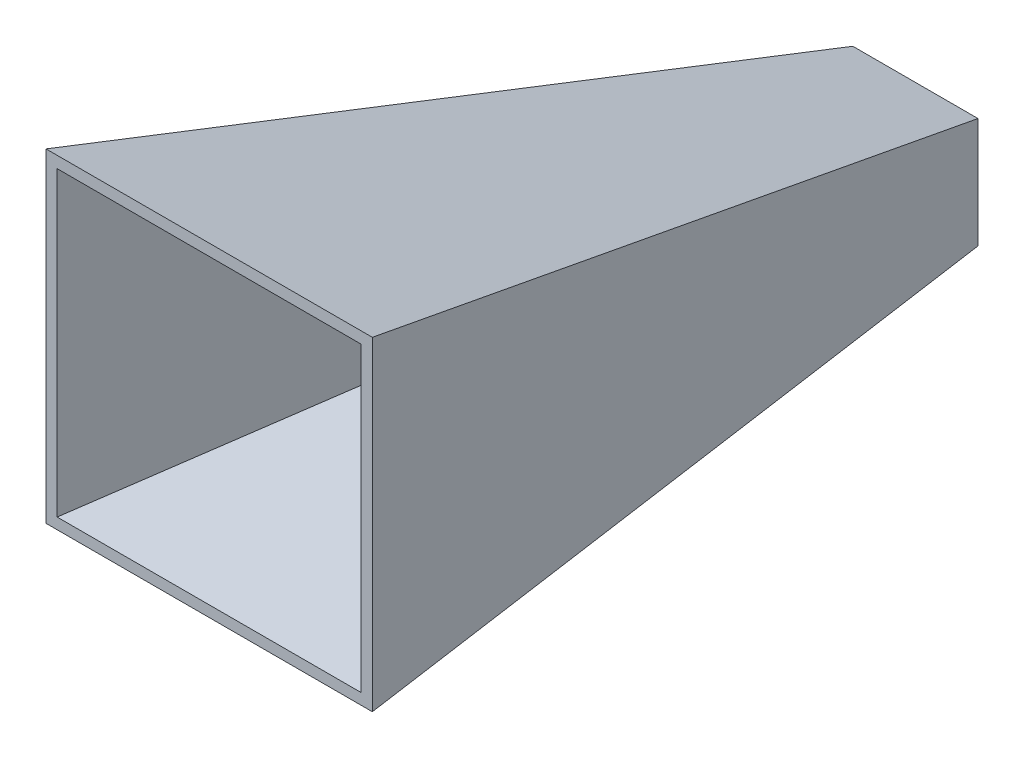
ISO-10303-21;
HEADER;
FILE_DESCRIPTION(('STEP AP214'),'2;1');
FILE_NAME('part.step','',(''),(''),'','','');
FILE_SCHEMA(('AUTOMOTIVE_DESIGN { 1 0 10303 214 1 1 1 1 }'));
ENDSEC;
DATA;
#1=APPLICATION_CONTEXT('core data for automotive mechanical design processes');
#2=APPLICATION_PROTOCOL_DEFINITION('international standard','automotive_design',2000,#1);
#3=PRODUCT_CONTEXT('',#1,'mechanical');
#4=PRODUCT('Part','Part','',(#3));
#5=PRODUCT_RELATED_PRODUCT_CATEGORY('part','',(#4));
#6=PRODUCT_DEFINITION_FORMATION('','',#4);
#7=PRODUCT_DEFINITION_CONTEXT('part definition',#1,'design');
#8=PRODUCT_DEFINITION('design','',#6,#7);
#9=PRODUCT_DEFINITION_SHAPE('','',#8);
#10=(LENGTH_UNIT() NAMED_UNIT(*) SI_UNIT(.MILLI.,.METRE.));
#11=(NAMED_UNIT(*) PLANE_ANGLE_UNIT() SI_UNIT($,.RADIAN.));
#12=(NAMED_UNIT(*) SI_UNIT($,.STERADIAN.) SOLID_ANGLE_UNIT());
#13=UNCERTAINTY_MEASURE_WITH_UNIT(LENGTH_MEASURE(1.E-05),#10,'distance_accuracy_value','');
#14=(GEOMETRIC_REPRESENTATION_CONTEXT(3) GLOBAL_UNCERTAINTY_ASSIGNED_CONTEXT((#13)) GLOBAL_UNIT_ASSIGNED_CONTEXT((#10,
#11,#12)) REPRESENTATION_CONTEXT('',''));
#15=CARTESIAN_POINT('',(0.,0.,0.));
#16=DIRECTION('',(0.,0.,1.));
#17=DIRECTION('',(1.,0.,0.));
#18=AXIS2_PLACEMENT_3D('',#15,#16,#17);
#19=CARTESIAN_POINT('',(0.,0.,304.8));
#20=DIRECTION('',(0.,0.,-1.));
#21=DIRECTION('',(-1.,0.,0.));
#22=AXIS2_PLACEMENT_3D('',#19,#20,#21);
#23=PLANE('',#22);
#24=DIRECTION('',(0.,-1.,0.));
#25=VECTOR('',#24,1.);
#26=CARTESIAN_POINT('',(0.,0.,304.8));
#27=LINE('',#26,#25);
#28=CARTESIAN_POINT('',(0.,139.954,304.8));
#29=VERTEX_POINT('',#28);
#30=CARTESIAN_POINT('',(0.,0.,304.8));
#31=VERTEX_POINT('',#30);
#32=EDGE_CURVE('E142',#29,#31,#27,.T.);
#33=ORIENTED_EDGE('',*,*,#32,.T.);
#34=DIRECTION('',(1.,0.,0.));
#35=VECTOR('',#34,1.);
#36=CARTESIAN_POINT('',(0.,0.,304.8));
#37=LINE('',#36,#35);
#38=CARTESIAN_POINT('',(140.843,0.,304.8));
#39=VERTEX_POINT('',#38);
#40=EDGE_CURVE('E145',#31,#39,#37,.T.);
#41=ORIENTED_EDGE('',*,*,#40,.T.);
#42=DIRECTION('',(0.,1.,0.));
#43=VECTOR('',#42,1.);
#44=CARTESIAN_POINT('',(140.843,0.,304.8));
#45=LINE('',#44,#43);
#46=CARTESIAN_POINT('',(140.843,139.954,304.8));
#47=VERTEX_POINT('',#46);
#48=EDGE_CURVE('E148',#39,#47,#45,.T.);
#49=ORIENTED_EDGE('',*,*,#48,.T.);
#50=DIRECTION('',(-1.,0.,0.));
#51=VECTOR('',#50,1.);
#52=CARTESIAN_POINT('',(0.,139.954,304.8));
#53=LINE('',#52,#51);
#54=EDGE_CURVE('E151',#47,#29,#53,.T.);
#55=ORIENTED_EDGE('',*,*,#54,.T.);
#56=EDGE_LOOP('',(#33,#41,#49,#55));
#57=FACE_BOUND('',#56,.T.);
#58=DIRECTION('',(0.,-1.,0.));
#59=VECTOR('',#58,1.);
#60=CARTESIAN_POINT('',(4.81055527249978,0.,304.8));
#61=LINE('',#60,#59);
#62=CARTESIAN_POINT('',(4.81055527249978,134.977794796946,304.8));
#63=VERTEX_POINT('',#62);
#64=CARTESIAN_POINT('',(4.81055527249978,4.7625,304.8));
#65=VERTEX_POINT('',#64);
#66=EDGE_CURVE('E110',#63,#65,#61,.T.);
#67=ORIENTED_EDGE('',*,*,#66,.F.);
#68=DIRECTION('',(-1.,0.,0.));
#69=VECTOR('',#68,1.);
#70=CARTESIAN_POINT('',(0.,134.977794796946,304.8));
#71=LINE('',#70,#69);
#72=CARTESIAN_POINT('',(136.0324447275,134.977794796946,304.8));
#73=VERTEX_POINT('',#72);
#74=EDGE_CURVE('E114',#73,#63,#71,.T.);
#75=ORIENTED_EDGE('',*,*,#74,.F.);
#76=DIRECTION('',(0.,1.,0.));
#77=VECTOR('',#76,1.);
#78=CARTESIAN_POINT('',(136.0324447275,0.,304.8));
#79=LINE('',#78,#77);
#80=CARTESIAN_POINT('',(136.0324447275,4.7625,304.8));
#81=VERTEX_POINT('',#80);
#82=EDGE_CURVE('E48',#81,#73,#79,.T.);
#83=ORIENTED_EDGE('',*,*,#82,.F.);
#84=DIRECTION('',(1.,0.,0.));
#85=VECTOR('',#84,1.);
#86=CARTESIAN_POINT('',(0.,4.7625,304.8));
#87=LINE('',#86,#85);
#88=EDGE_CURVE('E104',#65,#81,#87,.T.);
#89=ORIENTED_EDGE('',*,*,#88,.F.);
#90=EDGE_LOOP('',(#67,#75,#83,#89));
#91=FACE_BOUND('',#90,.T.);
#92=ADVANCED_FACE('F33',(#57,#91),#23,.F.);
#93=CARTESIAN_POINT('',(0.,0.,0.));
#94=DIRECTION('',(0.,0.,-1.));
#95=DIRECTION('',(-1.,0.,0.));
#96=AXIS2_PLACEMENT_3D('',#93,#94,#95);
#97=PLANE('',#96);
#98=DIRECTION('',(0.,-1.,0.));
#99=VECTOR('',#98,1.);
#100=CARTESIAN_POINT('',(43.4086,139.954,0.));
#101=LINE('',#100,#99);
#102=CARTESIAN_POINT('',(43.4086,47.625,0.));
#103=VERTEX_POINT('',#102);
#104=CARTESIAN_POINT('',(43.4086,0.,0.));
#105=VERTEX_POINT('',#104);
#106=EDGE_CURVE('E130',#103,#105,#101,.T.);
#107=ORIENTED_EDGE('',*,*,#106,.F.);
#108=DIRECTION('',(1.,0.,0.));
#109=VECTOR('',#108,1.);
#110=CARTESIAN_POINT('',(0.,47.625,0.));
#111=LINE('',#110,#109);
#112=CARTESIAN_POINT('',(97.4344000000001,47.625,0.));
#113=VERTEX_POINT('',#112);
#114=EDGE_CURVE('E139',#103,#113,#111,.T.);
#115=ORIENTED_EDGE('',*,*,#114,.T.);
#116=DIRECTION('',(0.,-1.,0.));
#117=VECTOR('',#116,1.);
#118=CARTESIAN_POINT('',(97.4344,139.954,0.));
#119=LINE('',#118,#117);
#120=CARTESIAN_POINT('',(97.4344,0.,0.));
#121=VERTEX_POINT('',#120);
#122=EDGE_CURVE('E136',#113,#121,#119,.T.);
#123=ORIENTED_EDGE('',*,*,#122,.T.);
#124=DIRECTION('',(1.,0.,0.));
#125=VECTOR('',#124,1.);
#126=CARTESIAN_POINT('',(0.,0.,0.));
#127=LINE('',#126,#125);
#128=EDGE_CURVE('E141',#105,#121,#127,.T.);
#129=ORIENTED_EDGE('',*,*,#128,.F.);
#130=EDGE_LOOP('',(#107,#115,#123,#129));
#131=FACE_BOUND('',#130,.T.);
#132=DIRECTION('',(1.,0.,0.));
#133=VECTOR('',#132,1.);
#134=CARTESIAN_POINT('',(0.,42.6487947969461,0.));
#135=LINE('',#134,#133);
#136=CARTESIAN_POINT('',(48.2191552724998,42.6487947969461,0.));
#137=VERTEX_POINT('',#136);
#138=CARTESIAN_POINT('',(92.6238447275003,42.6487947969461,0.));
#139=VERTEX_POINT('',#138);
#140=EDGE_CURVE('E123',#137,#139,#135,.T.);
#141=ORIENTED_EDGE('',*,*,#140,.F.);
#142=DIRECTION('',(0.,-1.,0.));
#143=VECTOR('',#142,1.);
#144=CARTESIAN_POINT('',(48.2191552724998,0.,0.));
#145=LINE('',#144,#143);
#146=CARTESIAN_POINT('',(48.2191552724998,4.7625,0.));
#147=VERTEX_POINT('',#146);
#148=EDGE_CURVE('E101',#137,#147,#145,.T.);
#149=ORIENTED_EDGE('',*,*,#148,.T.);
#150=DIRECTION('',(1.,0.,0.));
#151=VECTOR('',#150,1.);
#152=CARTESIAN_POINT('',(0.,4.7625,0.));
#153=LINE('',#152,#151);
#154=CARTESIAN_POINT('',(92.6238447275003,4.7625,0.));
#155=VERTEX_POINT('',#154);
#156=EDGE_CURVE('E121',#147,#155,#153,.T.);
#157=ORIENTED_EDGE('',*,*,#156,.T.);
#158=DIRECTION('',(0.,-1.,0.));
#159=VECTOR('',#158,1.);
#160=CARTESIAN_POINT('',(92.6238447275003,139.954,0.));
#161=LINE('',#160,#159);
#162=EDGE_CURVE('E53',#139,#155,#161,.T.);
#163=ORIENTED_EDGE('',*,*,#162,.F.);
#164=EDGE_LOOP('',(#141,#149,#157,#163));
#165=FACE_BOUND('',#164,.T.);
#166=ADVANCED_FACE('F166',(#131,#165),#97,.T.);
#167=CARTESIAN_POINT('',(0.,0.,304.8));
#168=DIRECTION('',(0.,1.,0.));
#169=DIRECTION('',(0.,0.,1.));
#170=AXIS2_PLACEMENT_3D('',#167,#168,#169);
#171=PLANE('',#170);
#172=ORIENTED_EDGE('',*,*,#40,.F.);
#173=DIRECTION('',(-0.140993988547926,0.,0.990010452062678));
#174=VECTOR('',#173,1.);
#175=CARTESIAN_POINT('',(0.,0.,304.8));
#176=LINE('',#175,#174);
#177=EDGE_CURVE('E128',#105,#31,#176,.T.);
#178=ORIENTED_EDGE('',*,*,#177,.F.);
#179=ORIENTED_EDGE('',*,*,#128,.T.);
#180=DIRECTION('',(-0.140993988547926,0.,-0.990010452062678));
#181=VECTOR('',#180,1.);
#182=CARTESIAN_POINT('',(140.843,0.,304.8));
#183=LINE('',#182,#181);
#184=EDGE_CURVE('E133',#39,#121,#183,.T.);
#185=ORIENTED_EDGE('',*,*,#184,.F.);
#186=EDGE_LOOP('',(#172,#178,#179,#185));
#187=FACE_BOUND('',#186,.T.);
#188=ADVANCED_FACE('F35',(#187),#171,.F.);
#189=CARTESIAN_POINT('',(0.,139.954,304.8));
#190=DIRECTION('',(0.,-0.957054583898044,0.289907784372449));
#191=DIRECTION('',(0.,-0.289907784372449,-0.957054583898044));
#192=AXIS2_PLACEMENT_3D('',#189,#190,#191);
#193=PLANE('',#192);
#194=ORIENTED_EDGE('',*,*,#114,.F.);
#195=DIRECTION('',(-0.135051811575288,0.28725180519378,0.948286564601201));
#196=VECTOR('',#195,1.);
#197=CARTESIAN_POINT('',(0.,139.954,304.8));
#198=LINE('',#197,#196);
#199=EDGE_CURVE('E11',#103,#29,#198,.T.);
#200=ORIENTED_EDGE('',*,*,#199,.T.);
#201=ORIENTED_EDGE('',*,*,#54,.F.);
#202=DIRECTION('',(-0.135051811575288,-0.28725180519378,-0.948286564601201));
#203=VECTOR('',#202,1.);
#204=CARTESIAN_POINT('',(138.274165676537,134.490154028211,286.762544247188));
#205=LINE('',#204,#203);
#206=EDGE_CURVE('E41',#47,#113,#205,.T.);
#207=ORIENTED_EDGE('',*,*,#206,.T.);
#208=EDGE_LOOP('',(#194,#200,#201,#207));
#209=FACE_BOUND('',#208,.T.);
#210=ADVANCED_FACE('F158',(#209),#193,.F.);
#211=CARTESIAN_POINT('',(140.843,139.954,304.8));
#212=DIRECTION('',(-0.990010452062678,0.,0.140993988547926));
#213=DIRECTION('',(0.140993988547926,0.,0.990010452062678));
#214=AXIS2_PLACEMENT_3D('',#211,#212,#213);
#215=PLANE('',#214);
#216=ORIENTED_EDGE('',*,*,#48,.F.);
#217=ORIENTED_EDGE('',*,*,#184,.T.);
#218=ORIENTED_EDGE('',*,*,#122,.F.);
#219=ORIENTED_EDGE('',*,*,#206,.F.);
#220=EDGE_LOOP('',(#216,#217,#218,#219));
#221=FACE_BOUND('',#220,.T.);
#222=ADVANCED_FACE('F161',(#221),#215,.F.);
#223=CARTESIAN_POINT('',(0.,139.954,304.8));
#224=DIRECTION('',(0.990010452062678,0.,0.140993988547926));
#225=DIRECTION('',(0.140993988547926,0.,-0.990010452062678));
#226=AXIS2_PLACEMENT_3D('',#223,#224,#225);
#227=PLANE('',#226);
#228=ORIENTED_EDGE('',*,*,#106,.T.);
#229=ORIENTED_EDGE('',*,*,#177,.T.);
#230=ORIENTED_EDGE('',*,*,#32,.F.);
#231=ORIENTED_EDGE('',*,*,#199,.F.);
#232=EDGE_LOOP('',(#228,#229,#230,#231));
#233=FACE_BOUND('',#232,.T.);
#234=ADVANCED_FACE('F170',(#233),#227,.F.);
#235=CARTESIAN_POINT('',(0.,4.7625,304.8));
#236=DIRECTION('',(0.,1.,0.));
#237=DIRECTION('',(0.,0.,1.));
#238=AXIS2_PLACEMENT_3D('',#235,#236,#237);
#239=PLANE('',#238);
#240=ORIENTED_EDGE('',*,*,#88,.T.);
#241=DIRECTION('',(-0.140993988547926,0.,-0.990010452062678));
#242=VECTOR('',#241,1.);
#243=CARTESIAN_POINT('',(136.128075222052,4.7625,305.47148387046));
#244=LINE('',#243,#242);
#245=EDGE_CURVE('E95',#81,#155,#244,.T.);
#246=ORIENTED_EDGE('',*,*,#245,.T.);
#247=ORIENTED_EDGE('',*,*,#156,.F.);
#248=DIRECTION('',(-0.140993988547926,0.,0.990010452062678));
#249=VECTOR('',#248,1.);
#250=CARTESIAN_POINT('',(4.7149247779485,4.7625,305.47148387046));
#251=LINE('',#250,#249);
#252=EDGE_CURVE('E106',#147,#65,#251,.T.);
#253=ORIENTED_EDGE('',*,*,#252,.T.);
#254=EDGE_LOOP('',(#240,#246,#247,#253));
#255=FACE_BOUND('',#254,.T.);
#256=ADVANCED_FACE('F105',(#255),#239,.T.);
#257=CARTESIAN_POINT('',(0.,135.396027544186,306.180685823074));
#258=DIRECTION('',(0.,-0.957054583898044,0.289907784372449));
#259=DIRECTION('',(0.,-0.289907784372449,-0.957054583898044));
#260=AXIS2_PLACEMENT_3D('',#257,#258,#259);
#261=PLANE('',#260);
#262=ORIENTED_EDGE('',*,*,#140,.T.);
#263=DIRECTION('',(-0.135051811575288,-0.28725180519378,-0.948286564601201));
#264=VECTOR('',#263,1.);
#265=CARTESIAN_POINT('',(133.744396373183,130.111173516699,288.734125072086));
#266=LINE('',#265,#264);
#267=EDGE_CURVE('E116',#73,#139,#266,.T.);
#268=ORIENTED_EDGE('',*,*,#267,.F.);
#269=ORIENTED_EDGE('',*,*,#74,.T.);
#270=DIRECTION('',(-0.135051811575288,0.28725180519378,0.948286564601201));
#271=VECTOR('',#270,1.);
#272=CARTESIAN_POINT('',(4.52976930335387,135.575019488488,306.771580824898));
#273=LINE('',#272,#271);
#274=EDGE_CURVE('E131',#137,#63,#273,.T.);
#275=ORIENTED_EDGE('',*,*,#274,.F.);
#276=EDGE_LOOP('',(#262,#268,#269,#275));
#277=FACE_BOUND('',#276,.T.);
#278=ADVANCED_FACE('F192',(#277),#261,.T.);
#279=CARTESIAN_POINT('',(136.128075222052,139.954,305.47148387046));
#280=DIRECTION('',(-0.990010452062678,0.,0.140993988547926));
#281=DIRECTION('',(0.140993988547926,0.,0.990010452062678));
#282=AXIS2_PLACEMENT_3D('',#279,#280,#281);
#283=PLANE('',#282);
#284=ORIENTED_EDGE('',*,*,#82,.T.);
#285=ORIENTED_EDGE('',*,*,#267,.T.);
#286=ORIENTED_EDGE('',*,*,#162,.T.);
#287=ORIENTED_EDGE('',*,*,#245,.F.);
#288=EDGE_LOOP('',(#284,#285,#286,#287));
#289=FACE_BOUND('',#288,.T.);
#290=ADVANCED_FACE('F97',(#289),#283,.T.);
#291=CARTESIAN_POINT('',(4.7149247779485,139.954,305.47148387046));
#292=DIRECTION('',(0.990010452062678,0.,0.140993988547926));
#293=DIRECTION('',(0.140993988547926,0.,-0.990010452062678));
#294=AXIS2_PLACEMENT_3D('',#291,#292,#293);
#295=PLANE('',#294);
#296=ORIENTED_EDGE('',*,*,#148,.F.);
#297=ORIENTED_EDGE('',*,*,#274,.T.);
#298=ORIENTED_EDGE('',*,*,#66,.T.);
#299=ORIENTED_EDGE('',*,*,#252,.F.);
#300=EDGE_LOOP('',(#296,#297,#298,#299));
#301=FACE_BOUND('',#300,.T.);
#302=ADVANCED_FACE('F186',(#301),#295,.T.);
#303=CLOSED_SHELL('',(#92,#166,#188,#210,#222,#234,#256,#278,#290,#302));
#304=MANIFOLD_SOLID_BREP('B2',#303);
#305=ADVANCED_BREP_SHAPE_REPRESENTATION('',(#18,#304),#14);
#306=SHAPE_DEFINITION_REPRESENTATION(#9,#305);
ENDSEC;
END-ISO-10303-21;
